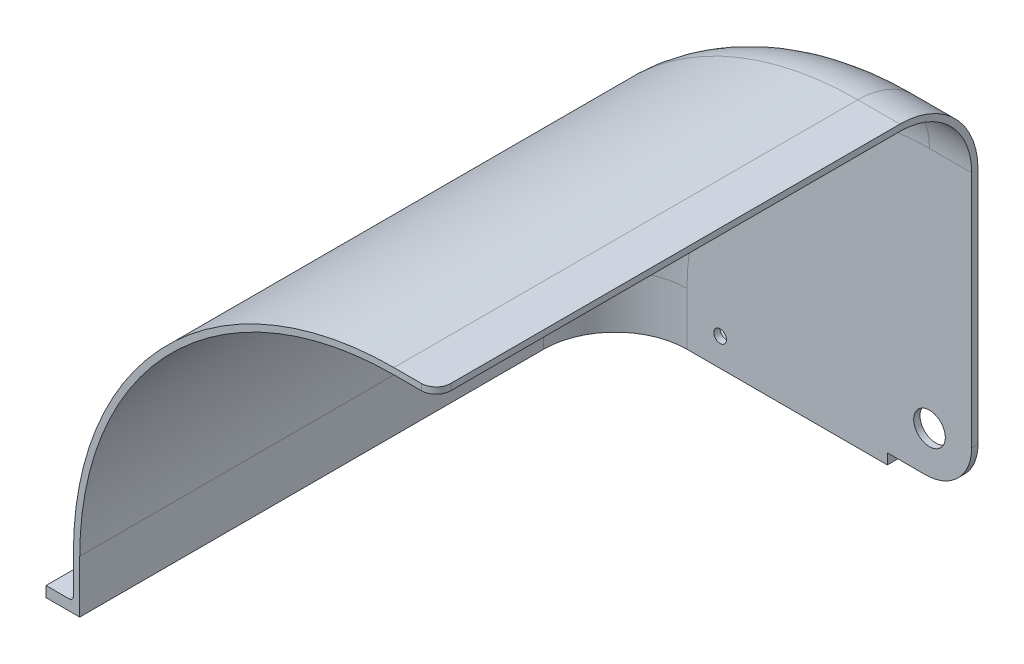
ISO-10303-21;
HEADER;
FILE_DESCRIPTION(('STEP AP214'),'2;1');
FILE_NAME('part.step','',(''),(''),'','','');
FILE_SCHEMA(('AUTOMOTIVE_DESIGN { 1 0 10303 214 1 1 1 1 }'));
ENDSEC;
DATA;
#1=APPLICATION_CONTEXT('core data for automotive mechanical design processes');
#2=APPLICATION_PROTOCOL_DEFINITION('international standard','automotive_design',2000,#1);
#3=PRODUCT_CONTEXT('',#1,'mechanical');
#4=PRODUCT('Part','Part','',(#3));
#5=PRODUCT_RELATED_PRODUCT_CATEGORY('part','',(#4));
#6=PRODUCT_DEFINITION_FORMATION('','',#4);
#7=PRODUCT_DEFINITION_CONTEXT('part definition',#1,'design');
#8=PRODUCT_DEFINITION('design','',#6,#7);
#9=PRODUCT_DEFINITION_SHAPE('','',#8);
#10=(LENGTH_UNIT() NAMED_UNIT(*) SI_UNIT(.MILLI.,.METRE.));
#11=(NAMED_UNIT(*) PLANE_ANGLE_UNIT() SI_UNIT($,.RADIAN.));
#12=(NAMED_UNIT(*) SI_UNIT($,.STERADIAN.) SOLID_ANGLE_UNIT());
#13=UNCERTAINTY_MEASURE_WITH_UNIT(LENGTH_MEASURE(1.E-05),#10,'distance_accuracy_value','');
#14=(GEOMETRIC_REPRESENTATION_CONTEXT(3) GLOBAL_UNCERTAINTY_ASSIGNED_CONTEXT((#13)) GLOBAL_UNIT_ASSIGNED_CONTEXT((#10,
#11,#12)) REPRESENTATION_CONTEXT('',''));
#15=CARTESIAN_POINT('',(0.,0.,0.));
#16=DIRECTION('',(0.,0.,1.));
#17=DIRECTION('',(1.,0.,0.));
#18=AXIS2_PLACEMENT_3D('',#15,#16,#17);
#19=CARTESIAN_POINT('',(0.,5.,0.));
#20=DIRECTION('',(0.,1.,0.));
#21=DIRECTION('',(0.,0.,1.));
#22=AXIS2_PLACEMENT_3D('',#19,#20,#21);
#23=PLANE('',#22);
#24=DIRECTION('',(-1.,0.,0.));
#25=VECTOR('',#24,1.);
#26=CARTESIAN_POINT('',(0.,5.,0.));
#27=LINE('',#26,#25);
#28=CARTESIAN_POINT('',(-154.,5.,0.));
#29=VERTEX_POINT('',#28);
#30=CARTESIAN_POINT('',(-165.,5.,0.));
#31=VERTEX_POINT('',#30);
#32=EDGE_CURVE('E197',#29,#31,#27,.T.);
#33=ORIENTED_EDGE('',*,*,#32,.F.);
#34=DIRECTION('',(0.,0.,1.));
#35=VECTOR('',#34,1.);
#36=CARTESIAN_POINT('',(-154.,5.,0.));
#37=LINE('',#36,#35);
#38=CARTESIAN_POINT('',(-154.,5.,-220.));
#39=VERTEX_POINT('',#38);
#40=EDGE_CURVE('E270',#29,#39,#37,.F.);
#41=ORIENTED_EDGE('',*,*,#40,.T.);
#42=CARTESIAN_POINT('',(-115.,5.,-220.));
#43=DIRECTION('',(0.,1.,0.));
#44=DIRECTION('',(0.,0.,1.));
#45=AXIS2_PLACEMENT_3D('',#42,#43,#44);
#46=CIRCLE('',#45,39.);
#47=CARTESIAN_POINT('',(-115.,5.,-259.));
#48=VERTEX_POINT('',#47);
#49=EDGE_CURVE('E272',#39,#48,#46,.F.);
#50=ORIENTED_EDGE('',*,*,#49,.T.);
#51=DIRECTION('',(-1.,0.,0.));
#52=VECTOR('',#51,1.);
#53=CARTESIAN_POINT('',(0.,5.,-259.));
#54=LINE('',#53,#52);
#55=CARTESIAN_POINT('',(-20.,5.,-259.));
#56=VERTEX_POINT('',#55);
#57=EDGE_CURVE('E274',#48,#56,#54,.F.);
#58=ORIENTED_EDGE('',*,*,#57,.T.);
#59=DIRECTION('',(0.,0.,1.));
#60=VECTOR('',#59,1.);
#61=CARTESIAN_POINT('',(-20.,5.,-310.311288741493));
#62=LINE('',#61,#60);
#63=CARTESIAN_POINT('',(-20.,5.,-270.));
#64=VERTEX_POINT('',#63);
#65=EDGE_CURVE('E412',#64,#56,#62,.T.);
#66=ORIENTED_EDGE('',*,*,#65,.F.);
#67=DIRECTION('',(-1.,0.,0.));
#68=VECTOR('',#67,1.);
#69=CARTESIAN_POINT('',(-165.,5.,-270.));
#70=LINE('',#69,#68);
#71=CARTESIAN_POINT('',(-160.,5.,-270.));
#72=VERTEX_POINT('',#71);
#73=EDGE_CURVE('E221',#64,#72,#70,.T.);
#74=ORIENTED_EDGE('',*,*,#73,.T.);
#75=CARTESIAN_POINT('',(-160.,5.,-265.));
#76=DIRECTION('',(0.,1.,0.));
#77=DIRECTION('',(0.,0.,1.));
#78=AXIS2_PLACEMENT_3D('',#75,#76,#77);
#79=CIRCLE('',#78,5.);
#80=CARTESIAN_POINT('',(-165.,5.,-265.));
#81=VERTEX_POINT('',#80);
#82=EDGE_CURVE('E262',#72,#81,#79,.T.);
#83=ORIENTED_EDGE('',*,*,#82,.T.);
#84=DIRECTION('',(0.,0.,1.));
#85=VECTOR('',#84,1.);
#86=CARTESIAN_POINT('',(-165.,5.,-270.));
#87=LINE('',#86,#85);
#88=EDGE_CURVE('E232',#81,#31,#87,.T.);
#89=ORIENTED_EDGE('',*,*,#88,.T.);
#90=EDGE_LOOP('',(#33,#41,#50,#58,#66,#74,#83,#89));
#91=FACE_BOUND('',#90,.T.);
#92=CARTESIAN_POINT('',(-159.,5.,-210.));
#93=DIRECTION('',(0.,1.,0.));
#94=DIRECTION('',(0.,0.,1.));
#95=AXIS2_PLACEMENT_3D('',#92,#93,#94);
#96=CIRCLE('',#95,1.59999999999999);
#97=CARTESIAN_POINT('',(-159.,5.,-208.4));
#98=VERTEX_POINT('',#97);
#99=EDGE_CURVE('E369',#98,#98,#96,.T.);
#100=ORIENTED_EDGE('',*,*,#99,.F.);
#101=EDGE_LOOP('',(#100));
#102=FACE_BOUND('',#101,.T.);
#103=CARTESIAN_POINT('',(-120.,5.,-264.));
#104=DIRECTION('',(0.,1.,0.));
#105=DIRECTION('',(0.,0.,1.));
#106=AXIS2_PLACEMENT_3D('',#103,#104,#105);
#107=CIRCLE('',#106,1.60000000000002);
#108=CARTESIAN_POINT('',(-120.,5.,-262.4));
#109=VERTEX_POINT('',#108);
#110=EDGE_CURVE('E381',#109,#109,#107,.T.);
#111=ORIENTED_EDGE('',*,*,#110,.F.);
#112=EDGE_LOOP('',(#111));
#113=FACE_BOUND('',#112,.T.);
#114=CARTESIAN_POINT('',(-159.,5.,-130.));
#115=DIRECTION('',(0.,1.,0.));
#116=DIRECTION('',(0.,0.,1.));
#117=AXIS2_PLACEMENT_3D('',#114,#115,#116);
#118=CIRCLE('',#117,1.59999999999999);
#119=CARTESIAN_POINT('',(-159.,5.,-128.4));
#120=VERTEX_POINT('',#119);
#121=EDGE_CURVE('E393',#120,#120,#118,.T.);
#122=ORIENTED_EDGE('',*,*,#121,.F.);
#123=EDGE_LOOP('',(#122));
#124=FACE_BOUND('',#123,.T.);
#125=CARTESIAN_POINT('',(-159.,5.,-50.));
#126=DIRECTION('',(0.,1.,0.));
#127=DIRECTION('',(0.,0.,1.));
#128=AXIS2_PLACEMENT_3D('',#125,#126,#127);
#129=CIRCLE('',#128,1.59999999999999);
#130=CARTESIAN_POINT('',(-159.,5.,-48.4));
#131=VERTEX_POINT('',#130);
#132=EDGE_CURVE('E387',#131,#131,#129,.T.);
#133=ORIENTED_EDGE('',*,*,#132,.F.);
#134=EDGE_LOOP('',(#133));
#135=FACE_BOUND('',#134,.T.);
#136=CARTESIAN_POINT('',(-40.,5.,-264.));
#137=DIRECTION('',(0.,1.,0.));
#138=DIRECTION('',(0.,0.,1.));
#139=AXIS2_PLACEMENT_3D('',#136,#137,#138);
#140=CIRCLE('',#139,1.60000000000001);
#141=CARTESIAN_POINT('',(-40.,5.,-262.4));
#142=VERTEX_POINT('',#141);
#143=EDGE_CURVE('E375',#142,#142,#140,.T.);
#144=ORIENTED_EDGE('',*,*,#143,.F.);
#145=EDGE_LOOP('',(#144));
#146=FACE_BOUND('',#145,.T.);
#147=ADVANCED_FACE('F40',(#91,#102,#113,#124,#135,#146),#23,.T.);
#148=CARTESIAN_POINT('',(0.,0.,0.));
#149=DIRECTION('',(0.,1.,0.));
#150=DIRECTION('',(0.,0.,1.));
#151=AXIS2_PLACEMENT_3D('',#148,#149,#150);
#152=PLANE('',#151);
#153=DIRECTION('',(0.,0.,-1.));
#154=VECTOR('',#153,1.);
#155=CARTESIAN_POINT('',(-149.,0.,254.));
#156=LINE('',#155,#154);
#157=CARTESIAN_POINT('',(-149.,0.,0.));
#158=VERTEX_POINT('',#157);
#159=CARTESIAN_POINT('',(-149.,0.,-220.));
#160=VERTEX_POINT('',#159);
#161=EDGE_CURVE('E212',#158,#160,#156,.T.);
#162=ORIENTED_EDGE('',*,*,#161,.F.);
#163=DIRECTION('',(1.,0.,0.));
#164=VECTOR('',#163,1.);
#165=CARTESIAN_POINT('',(20.,0.,0.));
#166=LINE('',#165,#164);
#167=CARTESIAN_POINT('',(-165.,0.,0.));
#168=VERTEX_POINT('',#167);
#169=EDGE_CURVE('E194',#168,#158,#166,.T.);
#170=ORIENTED_EDGE('',*,*,#169,.F.);
#171=DIRECTION('',(0.,0.,1.));
#172=VECTOR('',#171,1.);
#173=CARTESIAN_POINT('',(-165.,0.,-270.));
#174=LINE('',#173,#172);
#175=CARTESIAN_POINT('',(-165.,0.,-265.));
#176=VERTEX_POINT('',#175);
#177=EDGE_CURVE('E210',#176,#168,#174,.T.);
#178=ORIENTED_EDGE('',*,*,#177,.F.);
#179=CARTESIAN_POINT('',(-160.,0.,-265.));
#180=DIRECTION('',(0.,1.,0.));
#181=DIRECTION('',(0.,0.,1.));
#182=AXIS2_PLACEMENT_3D('',#179,#180,#181);
#183=CIRCLE('',#182,5.);
#184=CARTESIAN_POINT('',(-160.,0.,-270.));
#185=VERTEX_POINT('',#184);
#186=EDGE_CURVE('E258',#176,#185,#183,.F.);
#187=ORIENTED_EDGE('',*,*,#186,.T.);
#188=DIRECTION('',(-1.,0.,0.));
#189=VECTOR('',#188,1.);
#190=CARTESIAN_POINT('',(-165.,0.,-270.));
#191=LINE('',#190,#189);
#192=CARTESIAN_POINT('',(-20.,0.,-270.));
#193=VERTEX_POINT('',#192);
#194=EDGE_CURVE('E219',#193,#185,#191,.T.);
#195=ORIENTED_EDGE('',*,*,#194,.F.);
#196=DIRECTION('',(0.,0.,1.));
#197=VECTOR('',#196,1.);
#198=CARTESIAN_POINT('',(-20.,0.,-310.311288741493));
#199=LINE('',#198,#197);
#200=CARTESIAN_POINT('',(-20.,0.,-254.));
#201=VERTEX_POINT('',#200);
#202=EDGE_CURVE('E408',#193,#201,#199,.T.);
#203=ORIENTED_EDGE('',*,*,#202,.T.);
#204=DIRECTION('',(1.,0.,0.));
#205=VECTOR('',#204,1.);
#206=CARTESIAN_POINT('',(-149.,0.,-254.));
#207=LINE('',#206,#205);
#208=CARTESIAN_POINT('',(-115.,0.,-254.));
#209=VERTEX_POINT('',#208);
#210=EDGE_CURVE('E224',#209,#201,#207,.T.);
#211=ORIENTED_EDGE('',*,*,#210,.F.);
#212=CARTESIAN_POINT('',(-115.,0.,-220.));
#213=DIRECTION('',(0.,1.,0.));
#214=DIRECTION('',(0.,0.,1.));
#215=AXIS2_PLACEMENT_3D('',#212,#213,#214);
#216=CIRCLE('',#215,34.);
#217=EDGE_CURVE('E235',#209,#160,#216,.T.);
#218=ORIENTED_EDGE('',*,*,#217,.T.);
#219=EDGE_LOOP('',(#162,#170,#178,#187,#195,#203,#211,#218));
#220=FACE_BOUND('',#219,.T.);
#221=CARTESIAN_POINT('',(-159.,0.,-130.));
#222=DIRECTION('',(0.,1.,0.));
#223=DIRECTION('',(0.,0.,1.));
#224=AXIS2_PLACEMENT_3D('',#221,#222,#223);
#225=CIRCLE('',#224,1.59999999999999);
#226=CARTESIAN_POINT('',(-159.,0.,-128.4));
#227=VERTEX_POINT('',#226);
#228=EDGE_CURVE('E390',#227,#227,#225,.T.);
#229=ORIENTED_EDGE('',*,*,#228,.T.);
#230=EDGE_LOOP('',(#229));
#231=FACE_BOUND('',#230,.T.);
#232=CARTESIAN_POINT('',(-159.,0.,-50.));
#233=DIRECTION('',(0.,1.,0.));
#234=DIRECTION('',(0.,0.,1.));
#235=AXIS2_PLACEMENT_3D('',#232,#233,#234);
#236=CIRCLE('',#235,1.59999999999999);
#237=CARTESIAN_POINT('',(-159.,0.,-48.4));
#238=VERTEX_POINT('',#237);
#239=EDGE_CURVE('E384',#238,#238,#236,.T.);
#240=ORIENTED_EDGE('',*,*,#239,.T.);
#241=EDGE_LOOP('',(#240));
#242=FACE_BOUND('',#241,.T.);
#243=CARTESIAN_POINT('',(-120.,0.,-264.));
#244=DIRECTION('',(0.,1.,0.));
#245=DIRECTION('',(0.,0.,1.));
#246=AXIS2_PLACEMENT_3D('',#243,#244,#245);
#247=CIRCLE('',#246,1.60000000000002);
#248=CARTESIAN_POINT('',(-120.,0.,-262.4));
#249=VERTEX_POINT('',#248);
#250=EDGE_CURVE('E378',#249,#249,#247,.T.);
#251=ORIENTED_EDGE('',*,*,#250,.T.);
#252=EDGE_LOOP('',(#251));
#253=FACE_BOUND('',#252,.T.);
#254=CARTESIAN_POINT('',(-40.,0.,-264.));
#255=DIRECTION('',(0.,1.,0.));
#256=DIRECTION('',(0.,0.,1.));
#257=AXIS2_PLACEMENT_3D('',#254,#255,#256);
#258=CIRCLE('',#257,1.60000000000001);
#259=CARTESIAN_POINT('',(-40.,0.,-262.4));
#260=VERTEX_POINT('',#259);
#261=EDGE_CURVE('E372',#260,#260,#258,.T.);
#262=ORIENTED_EDGE('',*,*,#261,.T.);
#263=EDGE_LOOP('',(#262));
#264=FACE_BOUND('',#263,.T.);
#265=CARTESIAN_POINT('',(-159.,0.,-210.));
#266=DIRECTION('',(0.,1.,0.));
#267=DIRECTION('',(0.,0.,1.));
#268=AXIS2_PLACEMENT_3D('',#265,#266,#267);
#269=CIRCLE('',#268,1.59999999999999);
#270=CARTESIAN_POINT('',(-159.,0.,-208.4));
#271=VERTEX_POINT('',#270);
#272=EDGE_CURVE('E366',#271,#271,#269,.T.);
#273=ORIENTED_EDGE('',*,*,#272,.T.);
#274=EDGE_LOOP('',(#273));
#275=FACE_BOUND('',#274,.T.);
#276=ADVANCED_FACE('F208',(#220,#231,#242,#253,#264,#275),#152,.F.);
#277=CARTESIAN_POINT('',(-149.,5.,-254.));
#278=DIRECTION('',(0.,0.,-1.));
#279=DIRECTION('',(-1.,0.,0.));
#280=AXIS2_PLACEMENT_3D('',#277,#278,#279);
#281=PLANE('',#280);
#282=CARTESIAN_POINT('',(-99.3061123194261,13.2400656463833,-254.));
#283=DIRECTION('',(0.,0.,-1.));
#284=DIRECTION('',(-1.,0.,0.));
#285=AXIS2_PLACEMENT_3D('',#282,#283,#284);
#286=CIRCLE('',#285,3.00000000000001);
#287=CARTESIAN_POINT('',(-102.306112319426,13.2400656463833,-254.));
#288=VERTEX_POINT('',#287);
#289=EDGE_CURVE('E287',#288,#288,#286,.T.);
#290=ORIENTED_EDGE('',*,*,#289,.T.);
#291=EDGE_LOOP('',(#290));
#292=FACE_BOUND('',#291,.T.);
#293=CARTESIAN_POINT('',(0.,25.,-254.));
#294=DIRECTION('',(0.,0.,-1.));
#295=DIRECTION('',(-1.,0.,0.));
#296=AXIS2_PLACEMENT_3D('',#293,#294,#295);
#297=CIRCLE('',#296,7.5);
#298=CARTESIAN_POINT('',(-7.5,25.,-254.));
#299=VERTEX_POINT('',#298);
#300=EDGE_CURVE('E427',#299,#299,#297,.T.);
#301=ORIENTED_EDGE('',*,*,#300,.T.);
#302=EDGE_LOOP('',(#301));
#303=FACE_BOUND('',#302,.T.);
#304=DIRECTION('',(1.,0.,0.));
#305=VECTOR('',#304,1.);
#306=CARTESIAN_POINT('',(-149.,5.,-254.));
#307=LINE('',#306,#305);
#308=CARTESIAN_POINT('',(-20.,5.,-254.));
#309=VERTEX_POINT('',#308);
#310=CARTESIAN_POINT('',(-2.,5.,-254.));
#311=VERTEX_POINT('',#310);
#312=EDGE_CURVE('E316',#309,#311,#307,.T.);
#313=ORIENTED_EDGE('',*,*,#312,.T.);
#314=CARTESIAN_POINT('',(-2.,27.,-254.));
#315=DIRECTION('',(0.,0.,-1.));
#316=DIRECTION('',(-1.,0.,0.));
#317=AXIS2_PLACEMENT_3D('',#314,#315,#316);
#318=CIRCLE('',#317,22.);
#319=CARTESIAN_POINT('',(20.,27.,-254.));
#320=VERTEX_POINT('',#319);
#321=EDGE_CURVE('E253',#311,#320,#318,.F.);
#322=ORIENTED_EDGE('',*,*,#321,.T.);
#323=DIRECTION('',(0.,-1.,0.));
#324=VECTOR('',#323,1.);
#325=CARTESIAN_POINT('',(20.,5.,-254.));
#326=LINE('',#325,#324);
#327=CARTESIAN_POINT('',(20.,140.,-254.));
#328=VERTEX_POINT('',#327);
#329=EDGE_CURVE('E313',#328,#320,#326,.T.);
#330=ORIENTED_EDGE('',*,*,#329,.F.);
#331=DIRECTION('',(-1.,0.,0.));
#332=VECTOR('',#331,1.);
#333=CARTESIAN_POINT('',(20.,140.,-254.));
#334=LINE('',#333,#332);
#335=CARTESIAN_POINT('',(4.02455846426619E-13,140.,-254.));
#336=VERTEX_POINT('',#335);
#337=EDGE_CURVE('E333',#328,#336,#334,.T.);
#338=ORIENTED_EDGE('',*,*,#337,.T.);
#339=CARTESIAN_POINT('',(0.,25.,-254.));
#340=DIRECTION('',(0.,0.,1.));
#341=DIRECTION('',(1.,0.,0.));
#342=AXIS2_PLACEMENT_3D('',#339,#340,#341);
#343=CIRCLE('',#342,115.);
#344=CARTESIAN_POINT('',(-115.,25.,-254.));
#345=VERTEX_POINT('',#344);
#346=EDGE_CURVE('E348',#336,#345,#343,.T.);
#347=ORIENTED_EDGE('',*,*,#346,.T.);
#348=DIRECTION('',(0.,-1.,0.));
#349=VECTOR('',#348,1.);
#350=CARTESIAN_POINT('',(-115.,0.,-254.));
#351=LINE('',#350,#349);
#352=EDGE_CURVE('E231',#345,#209,#351,.T.);
#353=ORIENTED_EDGE('',*,*,#352,.T.);
#354=ORIENTED_EDGE('',*,*,#210,.T.);
#355=DIRECTION('',(0.,1.,0.));
#356=VECTOR('',#355,1.);
#357=CARTESIAN_POINT('',(-20.,5.,-254.));
#358=LINE('',#357,#356);
#359=EDGE_CURVE('E311',#201,#309,#358,.T.);
#360=ORIENTED_EDGE('',*,*,#359,.T.);
#361=EDGE_LOOP('',(#313,#322,#330,#338,#347,#353,#354,#360));
#362=FACE_BOUND('',#361,.T.);
#363=ADVANCED_FACE('F404',(#292,#303,#362),#281,.F.);
#364=CARTESIAN_POINT('',(-165.,5.,-270.));
#365=DIRECTION('',(0.,0.,1.));
#366=DIRECTION('',(1.,0.,0.));
#367=AXIS2_PLACEMENT_3D('',#364,#365,#366);
#368=PLANE('',#367);
#369=ORIENTED_EDGE('',*,*,#194,.T.);
#370=DIRECTION('',(0.,-1.,0.));
#371=VECTOR('',#370,1.);
#372=CARTESIAN_POINT('',(-160.,5.,-270.));
#373=LINE('',#372,#371);
#374=EDGE_CURVE('E260',#185,#72,#373,.F.);
#375=ORIENTED_EDGE('',*,*,#374,.T.);
#376=ORIENTED_EDGE('',*,*,#73,.F.);
#377=DIRECTION('',(0.,1.,0.));
#378=VECTOR('',#377,1.);
#379=CARTESIAN_POINT('',(-20.,0.,-270.));
#380=LINE('',#379,#378);
#381=EDGE_CURVE('E411',#193,#64,#380,.T.);
#382=ORIENTED_EDGE('',*,*,#381,.F.);
#383=EDGE_LOOP('',(#369,#375,#376,#382));
#384=FACE_BOUND('',#383,.T.);
#385=ADVANCED_FACE('F518',(#384),#368,.F.);
#386=CARTESIAN_POINT('',(-165.,5.,-270.));
#387=DIRECTION('',(1.,0.,0.));
#388=DIRECTION('',(0.,0.,-1.));
#389=AXIS2_PLACEMENT_3D('',#386,#387,#388);
#390=PLANE('',#389);
#391=ORIENTED_EDGE('',*,*,#177,.T.);
#392=DIRECTION('',(0.,1.,0.));
#393=VECTOR('',#392,1.);
#394=CARTESIAN_POINT('',(-165.,5.,0.));
#395=LINE('',#394,#393);
#396=EDGE_CURVE('E191',#168,#31,#395,.T.);
#397=ORIENTED_EDGE('',*,*,#396,.T.);
#398=ORIENTED_EDGE('',*,*,#88,.F.);
#399=DIRECTION('',(0.,-1.,0.));
#400=VECTOR('',#399,1.);
#401=CARTESIAN_POINT('',(-165.,5.,-265.));
#402=LINE('',#401,#400);
#403=EDGE_CURVE('E218',#81,#176,#402,.T.);
#404=ORIENTED_EDGE('',*,*,#403,.T.);
#405=EDGE_LOOP('',(#391,#397,#398,#404));
#406=FACE_BOUND('',#405,.T.);
#407=ADVANCED_FACE('F216',(#406),#390,.F.);
#408=CARTESIAN_POINT('',(-149.,5.,254.));
#409=DIRECTION('',(-1.,0.,0.));
#410=DIRECTION('',(0.,0.,1.));
#411=AXIS2_PLACEMENT_3D('',#408,#409,#410);
#412=PLANE('',#411);
#413=DIRECTION('',(0.,0.,-1.));
#414=VECTOR('',#413,1.);
#415=CARTESIAN_POINT('',(-149.,25.,-254.));
#416=LINE('',#415,#414);
#417=CARTESIAN_POINT('',(-149.,25.,0.));
#418=VERTEX_POINT('',#417);
#419=CARTESIAN_POINT('',(-149.,25.,-220.));
#420=VERTEX_POINT('',#419);
#421=EDGE_CURVE('E364',#418,#420,#416,.T.);
#422=ORIENTED_EDGE('',*,*,#421,.F.);
#423=DIRECTION('',(0.,-1.,0.));
#424=VECTOR('',#423,1.);
#425=CARTESIAN_POINT('',(-149.,5.,0.));
#426=LINE('',#425,#424);
#427=EDGE_CURVE('E439',#418,#158,#426,.T.);
#428=ORIENTED_EDGE('',*,*,#427,.T.);
#429=ORIENTED_EDGE('',*,*,#161,.T.);
#430=DIRECTION('',(0.,-1.,0.));
#431=VECTOR('',#430,1.);
#432=CARTESIAN_POINT('',(-149.,25.,-220.));
#433=LINE('',#432,#431);
#434=EDGE_CURVE('E228',#160,#420,#433,.F.);
#435=ORIENTED_EDGE('',*,*,#434,.T.);
#436=EDGE_LOOP('',(#422,#428,#429,#435));
#437=FACE_BOUND('',#436,.T.);
#438=ADVANCED_FACE('F512',(#437),#412,.F.);
#439=CARTESIAN_POINT('',(-159.,5.,-130.));
#440=DIRECTION('',(0.,-1.,0.));
#441=DIRECTION('',(0.,0.,-1.));
#442=AXIS2_PLACEMENT_3D('',#439,#440,#441);
#443=CYLINDRICAL_SURFACE('',#442,1.59999999999999);
#444=ORIENTED_EDGE('',*,*,#121,.T.);
#445=EDGE_LOOP('',(#444));
#446=FACE_BOUND('',#445,.T.);
#447=ORIENTED_EDGE('',*,*,#228,.F.);
#448=EDGE_LOOP('',(#447));
#449=FACE_BOUND('',#448,.T.);
#450=ADVANCED_FACE('F509',(#446,#449),#443,.F.);
#451=CARTESIAN_POINT('',(-159.,5.,-50.));
#452=DIRECTION('',(0.,-1.,0.));
#453=DIRECTION('',(0.,0.,-1.));
#454=AXIS2_PLACEMENT_3D('',#451,#452,#453);
#455=CYLINDRICAL_SURFACE('',#454,1.59999999999999);
#456=ORIENTED_EDGE('',*,*,#132,.T.);
#457=EDGE_LOOP('',(#456));
#458=FACE_BOUND('',#457,.T.);
#459=ORIENTED_EDGE('',*,*,#239,.F.);
#460=EDGE_LOOP('',(#459));
#461=FACE_BOUND('',#460,.T.);
#462=ADVANCED_FACE('F698',(#458,#461),#455,.F.);
#463=CARTESIAN_POINT('',(-120.,5.,-264.));
#464=DIRECTION('',(0.,-1.,0.));
#465=DIRECTION('',(0.,0.,-1.));
#466=AXIS2_PLACEMENT_3D('',#463,#464,#465);
#467=CYLINDRICAL_SURFACE('',#466,1.60000000000002);
#468=ORIENTED_EDGE('',*,*,#110,.T.);
#469=EDGE_LOOP('',(#468));
#470=FACE_BOUND('',#469,.T.);
#471=ORIENTED_EDGE('',*,*,#250,.F.);
#472=EDGE_LOOP('',(#471));
#473=FACE_BOUND('',#472,.T.);
#474=ADVANCED_FACE('F695',(#470,#473),#467,.F.);
#475=CARTESIAN_POINT('',(-40.,5.,-264.));
#476=DIRECTION('',(0.,-1.,0.));
#477=DIRECTION('',(0.,0.,-1.));
#478=AXIS2_PLACEMENT_3D('',#475,#476,#477);
#479=CYLINDRICAL_SURFACE('',#478,1.60000000000001);
#480=ORIENTED_EDGE('',*,*,#143,.T.);
#481=EDGE_LOOP('',(#480));
#482=FACE_BOUND('',#481,.T.);
#483=ORIENTED_EDGE('',*,*,#261,.F.);
#484=EDGE_LOOP('',(#483));
#485=FACE_BOUND('',#484,.T.);
#486=ADVANCED_FACE('F691',(#482,#485),#479,.F.);
#487=CARTESIAN_POINT('',(-159.,5.,-210.));
#488=DIRECTION('',(0.,-1.,0.));
#489=DIRECTION('',(0.,0.,-1.));
#490=AXIS2_PLACEMENT_3D('',#487,#488,#489);
#491=CYLINDRICAL_SURFACE('',#490,1.59999999999999);
#492=ORIENTED_EDGE('',*,*,#99,.T.);
#493=EDGE_LOOP('',(#492));
#494=FACE_BOUND('',#493,.T.);
#495=ORIENTED_EDGE('',*,*,#272,.F.);
#496=EDGE_LOOP('',(#495));
#497=FACE_BOUND('',#496,.T.);
#498=ADVANCED_FACE('F687',(#494,#497),#491,.F.);
#499=CARTESIAN_POINT('',(0.,25.,-257.));
#500=DIRECTION('',(0.,0.,1.));
#501=DIRECTION('',(1.,0.,0.));
#502=AXIS2_PLACEMENT_3D('',#499,#500,#501);
#503=PLANE('',#502);
#504=CARTESIAN_POINT('',(-99.3061123194261,13.2400656463833,-257.));
#505=DIRECTION('',(0.,0.,-1.));
#506=DIRECTION('',(-1.,0.,0.));
#507=AXIS2_PLACEMENT_3D('',#504,#505,#506);
#508=CIRCLE('',#507,3.00000000000001);
#509=CARTESIAN_POINT('',(-102.306112319426,13.2400656463833,-257.));
#510=VERTEX_POINT('',#509);
#511=EDGE_CURVE('E436',#510,#510,#508,.T.);
#512=ORIENTED_EDGE('',*,*,#511,.F.);
#513=EDGE_LOOP('',(#512));
#514=FACE_BOUND('',#513,.T.);
#515=CARTESIAN_POINT('',(0.,25.,-257.));
#516=DIRECTION('',(0.,0.,1.));
#517=DIRECTION('',(1.,0.,0.));
#518=AXIS2_PLACEMENT_3D('',#515,#516,#517);
#519=CIRCLE('',#518,7.5);
#520=CARTESIAN_POINT('',(7.5,25.,-257.));
#521=VERTEX_POINT('',#520);
#522=EDGE_CURVE('E290',#521,#521,#519,.F.);
#523=ORIENTED_EDGE('',*,*,#522,.F.);
#524=EDGE_LOOP('',(#523));
#525=FACE_BOUND('',#524,.T.);
#526=DIRECTION('',(0.,1.,0.));
#527=VECTOR('',#526,1.);
#528=CARTESIAN_POINT('',(-20.,0.,-257.));
#529=LINE('',#528,#527);
#530=CARTESIAN_POINT('',(-20.,5.,-257.));
#531=VERTEX_POINT('',#530);
#532=CARTESIAN_POINT('',(-20.,7.,-257.));
#533=VERTEX_POINT('',#532);
#534=EDGE_CURVE('E264',#531,#533,#529,.T.);
#535=ORIENTED_EDGE('',*,*,#534,.T.);
#536=DIRECTION('',(-1.,0.,0.));
#537=VECTOR('',#536,1.);
#538=CARTESIAN_POINT('',(0.,7.,-257.));
#539=LINE('',#538,#537);
#540=CARTESIAN_POINT('',(-115.,7.,-257.));
#541=VERTEX_POINT('',#540);
#542=EDGE_CURVE('E267',#533,#541,#539,.T.);
#543=ORIENTED_EDGE('',*,*,#542,.T.);
#544=DIRECTION('',(0.,-1.,0.));
#545=VECTOR('',#544,1.);
#546=CARTESIAN_POINT('',(-115.,25.,-257.));
#547=LINE('',#546,#545);
#548=CARTESIAN_POINT('',(-115.,25.,-257.));
#549=VERTEX_POINT('',#548);
#550=EDGE_CURVE('E243',#541,#549,#547,.F.);
#551=ORIENTED_EDGE('',*,*,#550,.T.);
#552=CARTESIAN_POINT('',(0.,25.,-257.));
#553=DIRECTION('',(0.,0.,1.));
#554=DIRECTION('',(1.,0.,0.));
#555=AXIS2_PLACEMENT_3D('',#552,#553,#554);
#556=CIRCLE('',#555,115.);
#557=CARTESIAN_POINT('',(4.02455846426619E-13,140.,-257.));
#558=VERTEX_POINT('',#557);
#559=EDGE_CURVE('E357',#558,#549,#556,.T.);
#560=ORIENTED_EDGE('',*,*,#559,.F.);
#561=DIRECTION('',(-1.,0.,0.));
#562=VECTOR('',#561,1.);
#563=CARTESIAN_POINT('',(20.,140.,-257.));
#564=LINE('',#563,#562);
#565=CARTESIAN_POINT('',(20.,140.,-257.));
#566=VERTEX_POINT('',#565);
#567=EDGE_CURVE('E330',#566,#558,#564,.T.);
#568=ORIENTED_EDGE('',*,*,#567,.F.);
#569=DIRECTION('',(0.,1.,0.));
#570=VECTOR('',#569,1.);
#571=CARTESIAN_POINT('',(20.,5.,-257.));
#572=LINE('',#571,#570);
#573=CARTESIAN_POINT('',(20.,27.,-257.));
#574=VERTEX_POINT('',#573);
#575=EDGE_CURVE('E322',#574,#566,#572,.T.);
#576=ORIENTED_EDGE('',*,*,#575,.F.);
#577=CARTESIAN_POINT('',(-2.,27.,-257.));
#578=DIRECTION('',(0.,0.,1.));
#579=DIRECTION('',(1.,0.,0.));
#580=AXIS2_PLACEMENT_3D('',#577,#578,#579);
#581=CIRCLE('',#580,22.);
#582=CARTESIAN_POINT('',(-2.,5.,-257.));
#583=VERTEX_POINT('',#582);
#584=EDGE_CURVE('E255',#574,#583,#581,.F.);
#585=ORIENTED_EDGE('',*,*,#584,.T.);
#586=DIRECTION('',(-1.,0.,0.));
#587=VECTOR('',#586,1.);
#588=CARTESIAN_POINT('',(0.,5.,-257.));
#589=LINE('',#588,#587);
#590=EDGE_CURVE('E360',#583,#531,#589,.T.);
#591=ORIENTED_EDGE('',*,*,#590,.T.);
#592=EDGE_LOOP('',(#535,#543,#551,#560,#568,#576,#585,#591));
#593=FACE_BOUND('',#592,.T.);
#594=ADVANCED_FACE('F483',(#514,#525,#593),#503,.F.);
#595=CARTESIAN_POINT('',(-152.,25.,-257.));
#596=DIRECTION('',(1.,0.,0.));
#597=DIRECTION('',(0.,0.,-1.));
#598=AXIS2_PLACEMENT_3D('',#595,#596,#597);
#599=PLANE('',#598);
#600=DIRECTION('',(0.,0.,1.));
#601=VECTOR('',#600,1.);
#602=CARTESIAN_POINT('',(-152.,7.,-257.));
#603=LINE('',#602,#601);
#604=CARTESIAN_POINT('',(-152.,7.,-220.));
#605=VERTEX_POINT('',#604);
#606=CARTESIAN_POINT('',(-152.,7.,0.));
#607=VERTEX_POINT('',#606);
#608=EDGE_CURVE('E278',#605,#607,#603,.T.);
#609=ORIENTED_EDGE('',*,*,#608,.T.);
#610=DIRECTION('',(0.,1.,0.));
#611=VECTOR('',#610,1.);
#612=CARTESIAN_POINT('',(-152.,25.,0.));
#613=LINE('',#612,#611);
#614=CARTESIAN_POINT('',(-152.,25.,0.));
#615=VERTEX_POINT('',#614);
#616=EDGE_CURVE('E213',#607,#615,#613,.T.);
#617=ORIENTED_EDGE('',*,*,#616,.T.);
#618=DIRECTION('',(0.,0.,1.));
#619=VECTOR('',#618,1.);
#620=CARTESIAN_POINT('',(-152.,25.,-257.));
#621=LINE('',#620,#619);
#622=CARTESIAN_POINT('',(-152.,25.,-220.));
#623=VERTEX_POINT('',#622);
#624=EDGE_CURVE('E361',#623,#615,#621,.T.);
#625=ORIENTED_EDGE('',*,*,#624,.F.);
#626=DIRECTION('',(0.,-1.,0.));
#627=VECTOR('',#626,1.);
#628=CARTESIAN_POINT('',(-152.,25.,-220.));
#629=LINE('',#628,#627);
#630=EDGE_CURVE('E240',#623,#605,#629,.T.);
#631=ORIENTED_EDGE('',*,*,#630,.T.);
#632=EDGE_LOOP('',(#609,#617,#625,#631));
#633=FACE_BOUND('',#632,.T.);
#634=ADVANCED_FACE('F452',(#633),#599,.F.);
#635=CARTESIAN_POINT('',(-115.,5.,-220.));
#636=DIRECTION('',(0.,1.,0.));
#637=DIRECTION('',(0.,0.,1.));
#638=AXIS2_PLACEMENT_3D('',#635,#636,#637);
#639=CYLINDRICAL_SURFACE('',#638,34.);
#640=CARTESIAN_POINT('',(-115.,25.,-220.));
#641=DIRECTION('',(0.,-1.,0.));
#642=DIRECTION('',(0.,0.,-1.));
#643=AXIS2_PLACEMENT_3D('',#640,#641,#642);
#644=CIRCLE('',#643,34.);
#645=EDGE_CURVE('E237',#420,#345,#644,.T.);
#646=ORIENTED_EDGE('',*,*,#645,.F.);
#647=ORIENTED_EDGE('',*,*,#434,.F.);
#648=ORIENTED_EDGE('',*,*,#217,.F.);
#649=ORIENTED_EDGE('',*,*,#352,.F.);
#650=EDGE_LOOP('',(#646,#647,#648,#649));
#651=FACE_BOUND('',#650,.T.);
#652=ADVANCED_FACE('F525',(#651),#639,.F.);
#653=CARTESIAN_POINT('',(-115.,25.,-220.));
#654=DIRECTION('',(0.,-1.,0.));
#655=DIRECTION('',(0.,0.,-1.));
#656=AXIS2_PLACEMENT_3D('',#653,#654,#655);
#657=CYLINDRICAL_SURFACE('',#656,37.);
#658=ORIENTED_EDGE('',*,*,#550,.F.);
#659=CARTESIAN_POINT('',(-115.,7.,-220.));
#660=DIRECTION('',(0.,1.,0.));
#661=DIRECTION('',(0.,0.,1.));
#662=AXIS2_PLACEMENT_3D('',#659,#660,#661);
#663=CIRCLE('',#662,37.);
#664=EDGE_CURVE('E276',#541,#605,#663,.T.);
#665=ORIENTED_EDGE('',*,*,#664,.T.);
#666=ORIENTED_EDGE('',*,*,#630,.F.);
#667=CARTESIAN_POINT('',(-115.,25.,-220.));
#668=DIRECTION('',(0.,-1.,0.));
#669=DIRECTION('',(0.,0.,-1.));
#670=AXIS2_PLACEMENT_3D('',#667,#668,#669);
#671=CIRCLE('',#670,37.);
#672=EDGE_CURVE('E245',#549,#623,#671,.F.);
#673=ORIENTED_EDGE('',*,*,#672,.F.);
#674=EDGE_LOOP('',(#658,#665,#666,#673));
#675=FACE_BOUND('',#674,.T.);
#676=ADVANCED_FACE('F464',(#675),#657,.T.);
#677=CARTESIAN_POINT('',(0.,25.,-220.));
#678=DIRECTION('',(0.,0.,1.));
#679=DIRECTION('',(1.,0.,0.));
#680=AXIS2_PLACEMENT_3D('',#677,#678,#679);
#681=TOROIDAL_SURFACE('',#680,115.,37.);
#682=CARTESIAN_POINT('',(0.,25.,-220.));
#683=DIRECTION('',(0.,0.,1.));
#684=DIRECTION('',(1.,0.,0.));
#685=AXIS2_PLACEMENT_3D('',#682,#683,#684);
#686=CIRCLE('',#685,152.);
#687=CARTESIAN_POINT('',(5.30825383648903E-13,177.,-220.));
#688=VERTEX_POINT('',#687);
#689=EDGE_CURVE('E354',#688,#623,#686,.T.);
#690=ORIENTED_EDGE('',*,*,#689,.F.);
#691=CARTESIAN_POINT('',(4.02455846426619E-13,140.,-220.));
#692=DIRECTION('',(1.,0.,0.));
#693=DIRECTION('',(0.,0.,1.));
#694=AXIS2_PLACEMENT_3D('',#691,#692,#693);
#695=CIRCLE('',#694,37.);
#696=EDGE_CURVE('E337',#558,#688,#695,.T.);
#697=ORIENTED_EDGE('',*,*,#696,.F.);
#698=ORIENTED_EDGE('',*,*,#559,.T.);
#699=ORIENTED_EDGE('',*,*,#672,.T.);
#700=EDGE_LOOP('',(#690,#697,#698,#699));
#701=FACE_BOUND('',#700,.T.);
#702=ADVANCED_FACE('F461',(#701),#681,.T.);
#703=CARTESIAN_POINT('',(0.,25.,-257.));
#704=DIRECTION('',(0.,0.,1.));
#705=DIRECTION('',(1.,0.,0.));
#706=AXIS2_PLACEMENT_3D('',#703,#704,#705);
#707=CYLINDRICAL_SURFACE('',#706,152.);
#708=ORIENTED_EDGE('',*,*,#624,.T.);
#709=CARTESIAN_POINT('',(0.,25.,0.));
#710=DIRECTION('',(0.,0.,-1.));
#711=DIRECTION('',(-1.,0.,0.));
#712=AXIS2_PLACEMENT_3D('',#709,#710,#711);
#713=CIRCLE('',#712,152.);
#714=CARTESIAN_POINT('',(5.30825383648903E-13,177.,0.));
#715=VERTEX_POINT('',#714);
#716=EDGE_CURVE('E203',#615,#715,#713,.T.);
#717=ORIENTED_EDGE('',*,*,#716,.T.);
#718=DIRECTION('',(0.,0.,1.));
#719=VECTOR('',#718,1.);
#720=CARTESIAN_POINT('',(5.30825383648903E-13,177.,-220.));
#721=LINE('',#720,#719);
#722=EDGE_CURVE('E340',#688,#715,#721,.T.);
#723=ORIENTED_EDGE('',*,*,#722,.F.);
#724=ORIENTED_EDGE('',*,*,#689,.T.);
#725=EDGE_LOOP('',(#708,#717,#723,#724));
#726=FACE_BOUND('',#725,.T.);
#727=ADVANCED_FACE('F456',(#726),#707,.T.);
#728=CARTESIAN_POINT('',(0.,25.,-257.));
#729=DIRECTION('',(0.,0.,1.));
#730=DIRECTION('',(1.,0.,0.));
#731=AXIS2_PLACEMENT_3D('',#728,#729,#730);
#732=CYLINDRICAL_SURFACE('',#731,149.);
#733=DIRECTION('',(0.,0.,-1.));
#734=VECTOR('',#733,1.);
#735=CARTESIAN_POINT('',(5.20417042793042E-13,174.,-220.));
#736=LINE('',#735,#734);
#737=CARTESIAN_POINT('',(5.20417042793042E-13,174.,0.));
#738=VERTEX_POINT('',#737);
#739=CARTESIAN_POINT('',(5.20417042793042E-13,174.,-220.));
#740=VERTEX_POINT('',#739);
#741=EDGE_CURVE('E343',#738,#740,#736,.T.);
#742=ORIENTED_EDGE('',*,*,#741,.F.);
#743=CARTESIAN_POINT('',(0.,25.,0.));
#744=DIRECTION('',(0.,0.,-1.));
#745=DIRECTION('',(-1.,0.,0.));
#746=AXIS2_PLACEMENT_3D('',#743,#744,#745);
#747=CIRCLE('',#746,149.);
#748=EDGE_CURVE('E441',#738,#418,#747,.F.);
#749=ORIENTED_EDGE('',*,*,#748,.T.);
#750=ORIENTED_EDGE('',*,*,#421,.T.);
#751=CARTESIAN_POINT('',(0.,25.,-220.));
#752=DIRECTION('',(0.,0.,1.));
#753=DIRECTION('',(1.,0.,0.));
#754=AXIS2_PLACEMENT_3D('',#751,#752,#753);
#755=CIRCLE('',#754,149.);
#756=EDGE_CURVE('E351',#740,#420,#755,.T.);
#757=ORIENTED_EDGE('',*,*,#756,.F.);
#758=EDGE_LOOP('',(#742,#749,#750,#757));
#759=FACE_BOUND('',#758,.T.);
#760=ADVANCED_FACE('F676',(#759),#732,.F.);
#761=CARTESIAN_POINT('',(0.,25.,-220.));
#762=DIRECTION('',(0.,0.,1.));
#763=DIRECTION('',(1.,0.,0.));
#764=AXIS2_PLACEMENT_3D('',#761,#762,#763);
#765=TOROIDAL_SURFACE('',#764,115.,34.);
#766=ORIENTED_EDGE('',*,*,#346,.F.);
#767=CARTESIAN_POINT('',(4.02455846426619E-13,140.,-220.));
#768=DIRECTION('',(-1.,0.,0.));
#769=DIRECTION('',(0.,0.,1.));
#770=AXIS2_PLACEMENT_3D('',#767,#768,#769);
#771=CIRCLE('',#770,34.);
#772=EDGE_CURVE('E345',#740,#336,#771,.T.);
#773=ORIENTED_EDGE('',*,*,#772,.F.);
#774=ORIENTED_EDGE('',*,*,#756,.T.);
#775=ORIENTED_EDGE('',*,*,#645,.T.);
#776=EDGE_LOOP('',(#766,#773,#774,#775));
#777=FACE_BOUND('',#776,.T.);
#778=ADVANCED_FACE('F603',(#777),#765,.F.);
#779=CARTESIAN_POINT('',(20.,174.,220.));
#780=DIRECTION('',(0.,1.,0.));
#781=DIRECTION('',(0.,0.,1.));
#782=AXIS2_PLACEMENT_3D('',#779,#780,#781);
#783=PLANE('',#782);
#784=DIRECTION('',(0.,0.,-1.));
#785=VECTOR('',#784,1.);
#786=CARTESIAN_POINT('',(20.,174.,220.));
#787=LINE('',#786,#785);
#788=CARTESIAN_POINT('',(20.,174.,-6.99999999999992));
#789=VERTEX_POINT('',#788);
#790=CARTESIAN_POINT('',(20.,174.,-220.));
#791=VERTEX_POINT('',#790);
#792=EDGE_CURVE('E300',#789,#791,#787,.T.);
#793=ORIENTED_EDGE('',*,*,#792,.F.);
#794=CARTESIAN_POINT('',(13.,174.,-6.99999999999998));
#795=DIRECTION('',(0.,1.,0.));
#796=DIRECTION('',(0.,0.,1.));
#797=AXIS2_PLACEMENT_3D('',#794,#795,#796);
#798=CIRCLE('',#797,7.);
#799=CARTESIAN_POINT('',(13.,174.,0.));
#800=VERTEX_POINT('',#799);
#801=EDGE_CURVE('E62',#789,#800,#798,.F.);
#802=ORIENTED_EDGE('',*,*,#801,.T.);
#803=DIRECTION('',(-1.,0.,0.));
#804=VECTOR('',#803,1.);
#805=CARTESIAN_POINT('',(20.,174.,0.));
#806=LINE('',#805,#804);
#807=EDGE_CURVE('E444',#800,#738,#806,.T.);
#808=ORIENTED_EDGE('',*,*,#807,.T.);
#809=ORIENTED_EDGE('',*,*,#741,.T.);
#810=DIRECTION('',(-1.,0.,0.));
#811=VECTOR('',#810,1.);
#812=CARTESIAN_POINT('',(20.,174.,-220.));
#813=LINE('',#812,#811);
#814=EDGE_CURVE('E308',#791,#740,#813,.T.);
#815=ORIENTED_EDGE('',*,*,#814,.F.);
#816=EDGE_LOOP('',(#793,#802,#808,#809,#815));
#817=FACE_BOUND('',#816,.T.);
#818=ADVANCED_FACE('F306',(#817),#783,.F.);
#819=CARTESIAN_POINT('',(20.,140.,-220.));
#820=DIRECTION('',(-1.,0.,0.));
#821=DIRECTION('',(0.,0.,1.));
#822=AXIS2_PLACEMENT_3D('',#819,#820,#821);
#823=CYLINDRICAL_SURFACE('',#822,34.);
#824=ORIENTED_EDGE('',*,*,#772,.T.);
#825=ORIENTED_EDGE('',*,*,#337,.F.);
#826=CARTESIAN_POINT('',(20.,140.,-220.));
#827=DIRECTION('',(-1.,0.,0.));
#828=DIRECTION('',(0.,0.,-1.));
#829=AXIS2_PLACEMENT_3D('',#826,#827,#828);
#830=CIRCLE('',#829,34.);
#831=EDGE_CURVE('E310',#791,#328,#830,.T.);
#832=ORIENTED_EDGE('',*,*,#831,.F.);
#833=ORIENTED_EDGE('',*,*,#814,.T.);
#834=EDGE_LOOP('',(#824,#825,#832,#833));
#835=FACE_BOUND('',#834,.T.);
#836=ADVANCED_FACE('F602',(#835),#823,.F.);
#837=CARTESIAN_POINT('',(20.,140.,-220.));
#838=DIRECTION('',(-1.,0.,0.));
#839=DIRECTION('',(0.,0.,1.));
#840=AXIS2_PLACEMENT_3D('',#837,#838,#839);
#841=CYLINDRICAL_SURFACE('',#840,37.);
#842=ORIENTED_EDGE('',*,*,#696,.T.);
#843=DIRECTION('',(-1.,0.,0.));
#844=VECTOR('',#843,1.);
#845=CARTESIAN_POINT('',(20.,177.,-220.));
#846=LINE('',#845,#844);
#847=CARTESIAN_POINT('',(20.,177.,-220.));
#848=VERTEX_POINT('',#847);
#849=EDGE_CURVE('E327',#848,#688,#846,.T.);
#850=ORIENTED_EDGE('',*,*,#849,.F.);
#851=CARTESIAN_POINT('',(20.,140.,-220.));
#852=DIRECTION('',(1.,0.,0.));
#853=DIRECTION('',(0.,0.,-1.));
#854=AXIS2_PLACEMENT_3D('',#851,#852,#853);
#855=CIRCLE('',#854,37.);
#856=EDGE_CURVE('E324',#566,#848,#855,.T.);
#857=ORIENTED_EDGE('',*,*,#856,.F.);
#858=ORIENTED_EDGE('',*,*,#567,.T.);
#859=EDGE_LOOP('',(#842,#850,#857,#858));
#860=FACE_BOUND('',#859,.T.);
#861=ADVANCED_FACE('F493',(#860),#841,.T.);
#862=CARTESIAN_POINT('',(20.,177.,220.));
#863=DIRECTION('',(0.,-1.,0.));
#864=DIRECTION('',(0.,0.,-1.));
#865=AXIS2_PLACEMENT_3D('',#862,#863,#864);
#866=PLANE('',#865);
#867=DIRECTION('',(1.,0.,0.));
#868=VECTOR('',#867,1.);
#869=CARTESIAN_POINT('',(20.,177.,0.));
#870=LINE('',#869,#868);
#871=CARTESIAN_POINT('',(13.,177.,0.));
#872=VERTEX_POINT('',#871);
#873=EDGE_CURVE('E202',#715,#872,#870,.T.);
#874=ORIENTED_EDGE('',*,*,#873,.T.);
#875=CARTESIAN_POINT('',(13.,177.,-6.99999999999998));
#876=DIRECTION('',(0.,-1.,0.));
#877=DIRECTION('',(0.,0.,-1.));
#878=AXIS2_PLACEMENT_3D('',#875,#876,#877);
#879=CIRCLE('',#878,7.);
#880=CARTESIAN_POINT('',(20.,177.,-6.99999999999992));
#881=VERTEX_POINT('',#880);
#882=EDGE_CURVE('E11',#872,#881,#879,.F.);
#883=ORIENTED_EDGE('',*,*,#882,.T.);
#884=DIRECTION('',(0.,0.,1.));
#885=VECTOR('',#884,1.);
#886=CARTESIAN_POINT('',(20.,177.,220.));
#887=LINE('',#886,#885);
#888=EDGE_CURVE('E303',#848,#881,#887,.T.);
#889=ORIENTED_EDGE('',*,*,#888,.F.);
#890=ORIENTED_EDGE('',*,*,#849,.T.);
#891=ORIENTED_EDGE('',*,*,#722,.T.);
#892=EDGE_LOOP('',(#874,#883,#889,#890,#891));
#893=FACE_BOUND('',#892,.T.);
#894=ADVANCED_FACE('F495',(#893),#866,.F.);
#895=CARTESIAN_POINT('',(20.,140.,220.));
#896=DIRECTION('',(1.,0.,0.));
#897=DIRECTION('',(0.,0.,-1.));
#898=AXIS2_PLACEMENT_3D('',#895,#896,#897);
#899=PLANE('',#898);
#900=ORIENTED_EDGE('',*,*,#888,.T.);
#901=DIRECTION('',(0.,-1.,0.));
#902=VECTOR('',#901,1.);
#903=CARTESIAN_POINT('',(20.,174.,-6.99999999999998));
#904=LINE('',#903,#902);
#905=EDGE_CURVE('E293',#881,#789,#904,.T.);
#906=ORIENTED_EDGE('',*,*,#905,.T.);
#907=ORIENTED_EDGE('',*,*,#792,.T.);
#908=ORIENTED_EDGE('',*,*,#831,.T.);
#909=ORIENTED_EDGE('',*,*,#329,.T.);
#910=DIRECTION('',(0.,0.,1.));
#911=VECTOR('',#910,1.);
#912=CARTESIAN_POINT('',(20.,27.,-257.));
#913=LINE('',#912,#911);
#914=EDGE_CURVE('E248',#320,#574,#913,.F.);
#915=ORIENTED_EDGE('',*,*,#914,.T.);
#916=ORIENTED_EDGE('',*,*,#575,.T.);
#917=ORIENTED_EDGE('',*,*,#856,.T.);
#918=EDGE_LOOP('',(#900,#906,#907,#908,#909,#915,#916,#917));
#919=FACE_BOUND('',#918,.T.);
#920=ADVANCED_FACE('F299',(#919),#899,.T.);
#921=CARTESIAN_POINT('',(-20.,0.,-310.311288741493));
#922=DIRECTION('',(-1.,0.,0.));
#923=DIRECTION('',(0.,0.,1.));
#924=AXIS2_PLACEMENT_3D('',#921,#922,#923);
#925=PLANE('',#924);
#926=ORIENTED_EDGE('',*,*,#202,.F.);
#927=ORIENTED_EDGE('',*,*,#381,.T.);
#928=ORIENTED_EDGE('',*,*,#65,.T.);
#929=CARTESIAN_POINT('',(-20.,7.,-259.));
#930=DIRECTION('',(-1.,0.,0.));
#931=DIRECTION('',(0.,0.,1.));
#932=AXIS2_PLACEMENT_3D('',#929,#930,#931);
#933=CIRCLE('',#932,2.);
#934=EDGE_CURVE('E281',#56,#533,#933,.T.);
#935=ORIENTED_EDGE('',*,*,#934,.T.);
#936=ORIENTED_EDGE('',*,*,#534,.F.);
#937=EDGE_CURVE('E416',#531,#309,#62,.T.);
#938=ORIENTED_EDGE('',*,*,#937,.T.);
#939=ORIENTED_EDGE('',*,*,#359,.F.);
#940=EDGE_LOOP('',(#926,#927,#928,#935,#936,#938,#939));
#941=FACE_BOUND('',#940,.T.);
#942=ADVANCED_FACE('F426',(#941),#925,.F.);
#943=CARTESIAN_POINT('',(20.,5.,-310.311288741493));
#944=DIRECTION('',(0.,1.,0.));
#945=DIRECTION('',(0.,0.,1.));
#946=AXIS2_PLACEMENT_3D('',#943,#944,#945);
#947=PLANE('',#946);
#948=ORIENTED_EDGE('',*,*,#590,.F.);
#949=DIRECTION('',(0.,0.,1.));
#950=VECTOR('',#949,1.);
#951=CARTESIAN_POINT('',(-2.,5.,-254.));
#952=LINE('',#951,#950);
#953=EDGE_CURVE('E250',#583,#311,#952,.T.);
#954=ORIENTED_EDGE('',*,*,#953,.T.);
#955=ORIENTED_EDGE('',*,*,#312,.F.);
#956=ORIENTED_EDGE('',*,*,#937,.F.);
#957=EDGE_LOOP('',(#948,#954,#955,#956));
#958=FACE_BOUND('',#957,.T.);
#959=ADVANCED_FACE('F424',(#958),#947,.F.);
#960=CARTESIAN_POINT('',(-2.,27.,-310.311288741493));
#961=DIRECTION('',(0.,0.,-1.));
#962=DIRECTION('',(-1.,0.,0.));
#963=AXIS2_PLACEMENT_3D('',#960,#961,#962);
#964=CYLINDRICAL_SURFACE('',#963,22.);
#965=ORIENTED_EDGE('',*,*,#584,.F.);
#966=ORIENTED_EDGE('',*,*,#914,.F.);
#967=ORIENTED_EDGE('',*,*,#321,.F.);
#968=ORIENTED_EDGE('',*,*,#953,.F.);
#969=EDGE_LOOP('',(#965,#966,#967,#968));
#970=FACE_BOUND('',#969,.T.);
#971=ADVANCED_FACE('F487',(#970),#964,.T.);
#972=CARTESIAN_POINT('',(0.,25.,-278.213203435597));
#973=DIRECTION('',(0.,0.,1.));
#974=DIRECTION('',(1.,0.,0.));
#975=AXIS2_PLACEMENT_3D('',#972,#973,#974);
#976=CYLINDRICAL_SURFACE('',#975,7.5);
#977=ORIENTED_EDGE('',*,*,#522,.T.);
#978=EDGE_LOOP('',(#977));
#979=FACE_BOUND('',#978,.T.);
#980=ORIENTED_EDGE('',*,*,#300,.F.);
#981=EDGE_LOOP('',(#980));
#982=FACE_BOUND('',#981,.T.);
#983=ADVANCED_FACE('F533',(#979,#982),#976,.F.);
#984=CARTESIAN_POINT('',(-160.,5.,-265.));
#985=DIRECTION('',(0.,-1.,0.));
#986=DIRECTION('',(0.,0.,-1.));
#987=AXIS2_PLACEMENT_3D('',#984,#985,#986);
#988=CYLINDRICAL_SURFACE('',#987,5.);
#989=ORIENTED_EDGE('',*,*,#82,.F.);
#990=ORIENTED_EDGE('',*,*,#374,.F.);
#991=ORIENTED_EDGE('',*,*,#186,.F.);
#992=ORIENTED_EDGE('',*,*,#403,.F.);
#993=EDGE_LOOP('',(#989,#990,#991,#992));
#994=FACE_BOUND('',#993,.T.);
#995=ADVANCED_FACE('F534',(#994),#988,.T.);
#996=CARTESIAN_POINT('',(-154.,7.,-257.));
#997=DIRECTION('',(0.,0.,1.));
#998=DIRECTION('',(1.,0.,0.));
#999=AXIS2_PLACEMENT_3D('',#996,#997,#998);
#1000=CYLINDRICAL_SURFACE('',#999,2.);
#1001=ORIENTED_EDGE('',*,*,#40,.F.);
#1002=CARTESIAN_POINT('',(-154.,7.,0.));
#1003=DIRECTION('',(0.,0.,-1.));
#1004=DIRECTION('',(-1.,0.,0.));
#1005=AXIS2_PLACEMENT_3D('',#1002,#1003,#1004);
#1006=CIRCLE('',#1005,2.);
#1007=EDGE_CURVE('E283',#29,#607,#1006,.F.);
#1008=ORIENTED_EDGE('',*,*,#1007,.T.);
#1009=ORIENTED_EDGE('',*,*,#608,.F.);
#1010=CARTESIAN_POINT('',(-154.,7.,-220.));
#1011=DIRECTION('',(0.,0.,1.));
#1012=DIRECTION('',(1.,0.,0.));
#1013=AXIS2_PLACEMENT_3D('',#1010,#1011,#1012);
#1014=CIRCLE('',#1013,2.);
#1015=EDGE_CURVE('E286',#39,#605,#1014,.T.);
#1016=ORIENTED_EDGE('',*,*,#1015,.F.);
#1017=EDGE_LOOP('',(#1001,#1008,#1009,#1016));
#1018=FACE_BOUND('',#1017,.T.);
#1019=ADVANCED_FACE('F469',(#1018),#1000,.F.);
#1020=CARTESIAN_POINT('',(-115.,7.,-220.));
#1021=DIRECTION('',(0.,1.,0.));
#1022=DIRECTION('',(0.,0.,1.));
#1023=AXIS2_PLACEMENT_3D('',#1020,#1021,#1022);
#1024=TOROIDAL_SURFACE('',#1023,39.,2.);
#1025=ORIENTED_EDGE('',*,*,#1015,.T.);
#1026=ORIENTED_EDGE('',*,*,#664,.F.);
#1027=CARTESIAN_POINT('',(-115.,7.,-259.));
#1028=DIRECTION('',(-1.,0.,0.));
#1029=DIRECTION('',(0.,0.,1.));
#1030=AXIS2_PLACEMENT_3D('',#1027,#1028,#1029);
#1031=CIRCLE('',#1030,2.);
#1032=EDGE_CURVE('E284',#48,#541,#1031,.T.);
#1033=ORIENTED_EDGE('',*,*,#1032,.F.);
#1034=ORIENTED_EDGE('',*,*,#49,.F.);
#1035=EDGE_LOOP('',(#1025,#1026,#1033,#1034));
#1036=FACE_BOUND('',#1035,.T.);
#1037=ADVANCED_FACE('F472',(#1036),#1024,.F.);
#1038=CARTESIAN_POINT('',(0.,7.,-259.));
#1039=DIRECTION('',(-1.,0.,0.));
#1040=DIRECTION('',(0.,0.,1.));
#1041=AXIS2_PLACEMENT_3D('',#1038,#1039,#1040);
#1042=CYLINDRICAL_SURFACE('',#1041,2.);
#1043=ORIENTED_EDGE('',*,*,#934,.F.);
#1044=ORIENTED_EDGE('',*,*,#57,.F.);
#1045=ORIENTED_EDGE('',*,*,#1032,.T.);
#1046=ORIENTED_EDGE('',*,*,#542,.F.);
#1047=EDGE_LOOP('',(#1043,#1044,#1045,#1046));
#1048=FACE_BOUND('',#1047,.T.);
#1049=ADVANCED_FACE('F480',(#1048),#1042,.F.);
#1050=CARTESIAN_POINT('',(-99.3061123194261,13.2400656463833,-241.514718625761));
#1051=DIRECTION('',(0.,0.,-1.));
#1052=DIRECTION('',(-1.,0.,0.));
#1053=AXIS2_PLACEMENT_3D('',#1050,#1051,#1052);
#1054=CYLINDRICAL_SURFACE('',#1053,3.00000000000001);
#1055=ORIENTED_EDGE('',*,*,#511,.T.);
#1056=EDGE_LOOP('',(#1055));
#1057=FACE_BOUND('',#1056,.T.);
#1058=ORIENTED_EDGE('',*,*,#289,.F.);
#1059=EDGE_LOOP('',(#1058));
#1060=FACE_BOUND('',#1059,.T.);
#1061=ADVANCED_FACE('F500',(#1057,#1060),#1054,.F.);
#1062=CARTESIAN_POINT('',(20.,269.,0.));
#1063=DIRECTION('',(0.,0.,-1.));
#1064=DIRECTION('',(-1.,0.,0.));
#1065=AXIS2_PLACEMENT_3D('',#1062,#1063,#1064);
#1066=PLANE('',#1065);
#1067=ORIENTED_EDGE('',*,*,#807,.F.);
#1068=DIRECTION('',(0.,-1.,0.));
#1069=VECTOR('',#1068,1.);
#1070=CARTESIAN_POINT('',(13.,177.,0.));
#1071=LINE('',#1070,#1069);
#1072=EDGE_CURVE('E48',#800,#872,#1071,.F.);
#1073=ORIENTED_EDGE('',*,*,#1072,.T.);
#1074=ORIENTED_EDGE('',*,*,#873,.F.);
#1075=ORIENTED_EDGE('',*,*,#716,.F.);
#1076=ORIENTED_EDGE('',*,*,#616,.F.);
#1077=ORIENTED_EDGE('',*,*,#1007,.F.);
#1078=ORIENTED_EDGE('',*,*,#32,.T.);
#1079=ORIENTED_EDGE('',*,*,#396,.F.);
#1080=ORIENTED_EDGE('',*,*,#169,.T.);
#1081=ORIENTED_EDGE('',*,*,#427,.F.);
#1082=ORIENTED_EDGE('',*,*,#748,.F.);
#1083=EDGE_LOOP('',(#1067,#1073,#1074,#1075,#1076,#1077,#1078,#1079,#1080,#1081,#1082));
#1084=FACE_BOUND('',#1083,.T.);
#1085=ADVANCED_FACE('F193',(#1084),#1066,.F.);
#1086=CARTESIAN_POINT('',(13.,140.,-6.99999999999998));
#1087=DIRECTION('',(0.,1.,0.));
#1088=DIRECTION('',(0.,0.,1.));
#1089=AXIS2_PLACEMENT_3D('',#1086,#1087,#1088);
#1090=CYLINDRICAL_SURFACE('',#1089,7.);
#1091=ORIENTED_EDGE('',*,*,#882,.F.);
#1092=ORIENTED_EDGE('',*,*,#1072,.F.);
#1093=ORIENTED_EDGE('',*,*,#801,.F.);
#1094=ORIENTED_EDGE('',*,*,#905,.F.);
#1095=EDGE_LOOP('',(#1091,#1092,#1093,#1094));
#1096=FACE_BOUND('',#1095,.T.);
#1097=ADVANCED_FACE('F42',(#1096),#1090,.T.);
#1098=CLOSED_SHELL('',(#147,#276,#363,#385,#407,#438,#450,#462,#474,#486,#498,#594,#634,#652,
#676,#702,#727,#760,#778,#818,#836,#861,#894,#920,#942,#959,#971,#983,#995,#1019,#1037,#1049,
#1061,#1085,#1097));
#1099=MANIFOLD_SOLID_BREP('B2',#1098);
#1100=ADVANCED_BREP_SHAPE_REPRESENTATION('',(#18,#1099),#14);
#1101=SHAPE_DEFINITION_REPRESENTATION(#9,#1100);
ENDSEC;
END-ISO-10303-21;
